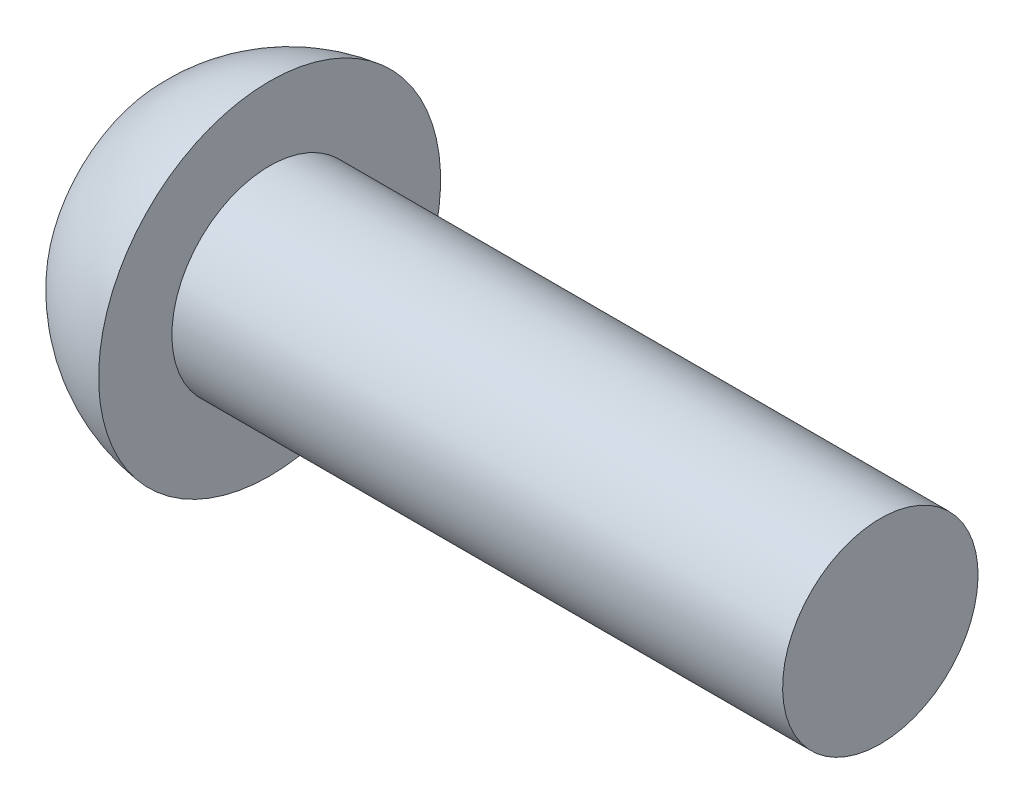
ISO-10303-21;
HEADER;
FILE_DESCRIPTION(('STEP AP214'),'2;1');
FILE_NAME('part.step','',(''),(''),'','','');
FILE_SCHEMA(('AUTOMOTIVE_DESIGN { 1 0 10303 214 1 1 1 1 }'));
ENDSEC;
DATA;
#1=APPLICATION_CONTEXT('core data for automotive mechanical design processes');
#2=APPLICATION_PROTOCOL_DEFINITION('international standard','automotive_design',2000,#1);
#3=PRODUCT_CONTEXT('',#1,'mechanical');
#4=PRODUCT('Part','Part','',(#3));
#5=PRODUCT_RELATED_PRODUCT_CATEGORY('part','',(#4));
#6=PRODUCT_DEFINITION_FORMATION('','',#4);
#7=PRODUCT_DEFINITION_CONTEXT('part definition',#1,'design');
#8=PRODUCT_DEFINITION('design','',#6,#7);
#9=PRODUCT_DEFINITION_SHAPE('','',#8);
#10=(LENGTH_UNIT() NAMED_UNIT(*) SI_UNIT(.MILLI.,.METRE.));
#11=(NAMED_UNIT(*) PLANE_ANGLE_UNIT() SI_UNIT($,.RADIAN.));
#12=(NAMED_UNIT(*) SI_UNIT($,.STERADIAN.) SOLID_ANGLE_UNIT());
#13=UNCERTAINTY_MEASURE_WITH_UNIT(LENGTH_MEASURE(1.E-05),#10,'distance_accuracy_value','');
#14=(GEOMETRIC_REPRESENTATION_CONTEXT(3) GLOBAL_UNCERTAINTY_ASSIGNED_CONTEXT((#13)) GLOBAL_UNIT_ASSIGNED_CONTEXT((#10,
#11,#12)) REPRESENTATION_CONTEXT('',''));
#15=CARTESIAN_POINT('',(0.,0.,0.));
#16=DIRECTION('',(0.,0.,1.));
#17=DIRECTION('',(1.,0.,0.));
#18=AXIS2_PLACEMENT_3D('',#15,#16,#17);
#19=CARTESIAN_POINT('',(-4.4,4.75,0.));
#20=DIRECTION('',(1.,0.,0.));
#21=DIRECTION('',(0.,1.,0.));
#22=AXIS2_PLACEMENT_3D('',#19,#20,#21);
#23=PLANE('',#22);
#24=DIRECTION('',(0.,1.,0.));
#25=VECTOR('',#24,1.);
#26=CARTESIAN_POINT('',(-4.4,-1.44337567297407,2.5));
#27=LINE('',#26,#25);
#28=CARTESIAN_POINT('',(-4.4,-1.44337567297407,2.5));
#29=VERTEX_POINT('',#28);
#30=CARTESIAN_POINT('',(-4.4,1.44337567297406,2.5));
#31=VERTEX_POINT('',#30);
#32=EDGE_CURVE('E128',#29,#31,#27,.T.);
#33=ORIENTED_EDGE('',*,*,#32,.F.);
#34=DIRECTION('',(0.,0.5,0.866025403784439));
#35=VECTOR('',#34,1.);
#36=CARTESIAN_POINT('',(-4.4,-2.88675134594813,0.));
#37=LINE('',#36,#35);
#38=CARTESIAN_POINT('',(-4.4,-2.88675134594813,0.));
#39=VERTEX_POINT('',#38);
#40=EDGE_CURVE('E37',#39,#29,#37,.T.);
#41=ORIENTED_EDGE('',*,*,#40,.F.);
#42=DIRECTION('',(0.,-0.5,0.866025403784439));
#43=VECTOR('',#42,1.);
#44=CARTESIAN_POINT('',(-4.4,-1.44337567297407,-2.5));
#45=LINE('',#44,#43);
#46=CARTESIAN_POINT('',(-4.4,-1.44337567297407,-2.5));
#47=VERTEX_POINT('',#46);
#48=EDGE_CURVE('E98',#47,#39,#45,.T.);
#49=ORIENTED_EDGE('',*,*,#48,.F.);
#50=DIRECTION('',(0.,-1.,0.));
#51=VECTOR('',#50,1.);
#52=CARTESIAN_POINT('',(-4.4,1.44337567297406,-2.5));
#53=LINE('',#52,#51);
#54=CARTESIAN_POINT('',(-4.4,1.44337567297406,-2.5));
#55=VERTEX_POINT('',#54);
#56=EDGE_CURVE('E136',#55,#47,#53,.T.);
#57=ORIENTED_EDGE('',*,*,#56,.F.);
#58=DIRECTION('',(0.,-0.5,-0.866025403784439));
#59=VECTOR('',#58,1.);
#60=CARTESIAN_POINT('',(-4.4,2.88675134594813,0.));
#61=LINE('',#60,#59);
#62=CARTESIAN_POINT('',(-4.4,2.88675134594813,0.));
#63=VERTEX_POINT('',#62);
#64=EDGE_CURVE('E133',#63,#55,#61,.T.);
#65=ORIENTED_EDGE('',*,*,#64,.F.);
#66=DIRECTION('',(0.,0.5,-0.866025403784439));
#67=VECTOR('',#66,1.);
#68=CARTESIAN_POINT('',(-4.4,1.44337567297406,2.5));
#69=LINE('',#68,#67);
#70=EDGE_CURVE('E130',#31,#63,#69,.T.);
#71=ORIENTED_EDGE('',*,*,#70,.F.);
#72=EDGE_LOOP('',(#33,#41,#49,#57,#65,#71));
#73=FACE_BOUND('',#72,.T.);
#74=CARTESIAN_POINT('',(-4.4,0.,0.));
#75=DIRECTION('',(-1.,0.,0.));
#76=DIRECTION('',(0.,-1.,0.));
#77=AXIS2_PLACEMENT_3D('',#74,#75,#76);
#78=CIRCLE('',#77,4.75);
#79=CARTESIAN_POINT('',(-4.4,4.75,0.));
#80=VERTEX_POINT('',#79);
#81=EDGE_CURVE('E10',#80,#80,#78,.T.);
#82=ORIENTED_EDGE('',*,*,#81,.T.);
#83=EDGE_LOOP('',(#82));
#84=FACE_BOUND('',#83,.T.);
#85=ADVANCED_FACE('F15',(#73,#84),#23,.F.);
#86=CARTESIAN_POINT('',(0.804261363636363,0.,0.));
#87=DIRECTION('',(-1.,0.,0.));
#88=DIRECTION('',(0.,1.,0.));
#89=AXIS2_PLACEMENT_3D('',#86,#87,#88);
#90=SPHERICAL_SURFACE('',#89,7.04605111683404);
#91=CARTESIAN_POINT('',(0.,0.,0.));
#92=DIRECTION('',(-1.,0.,0.));
#93=DIRECTION('',(0.,-1.,0.));
#94=AXIS2_PLACEMENT_3D('',#91,#92,#93);
#95=CIRCLE('',#94,7.);
#96=CARTESIAN_POINT('',(0.,7.,0.));
#97=VERTEX_POINT('',#96);
#98=EDGE_CURVE('E22',#97,#97,#95,.T.);
#99=CARTESIAN_POINT('',(-4.4,4.75,0.));
#100=CARTESIAN_POINT('',(-4.36454288512353,4.78884817687277,0.));
#101=CARTESIAN_POINT('',(-4.32865063666699,4.82729919585031,0.));
#102=CARTESIAN_POINT('',(-4.25601420845185,4.90338795759343,0.));
#103=CARTESIAN_POINT('',(-4.21927002869325,4.94102570035901,0.));
#104=CARTESIAN_POINT('',(-4.14494807373204,5.01546894925673,0.));
#105=CARTESIAN_POINT('',(-4.10737029852943,5.05227445538887,0.));
#106=CARTESIAN_POINT('',(-4.03140002103513,5.12503479721963,0.));
#107=CARTESIAN_POINT('',(-3.99300751874343,5.16098963291825,0.));
#108=CARTESIAN_POINT('',(-3.91542703331494,5.23203059738727,0.));
#109=CARTESIAN_POINT('',(-3.87623905017815,5.26711672615766,0.));
#110=CARTESIAN_POINT('',(-3.79708725643281,5.33640268375269,0.));
#111=CARTESIAN_POINT('',(-3.75712344582426,5.37060251257732,0.));
#112=CARTESIAN_POINT('',(-3.67644003736148,5.43809871961472,0.));
#113=CARTESIAN_POINT('',(-3.63572043950726,5.47139509782748,0.));
#114=CARTESIAN_POINT('',(-3.55354587637469,5.53706770659259,0.));
#115=CARTESIAN_POINT('',(-3.51209091109635,5.56944393714494,0.));
#116=CARTESIAN_POINT('',(-3.42846640154439,5.63326001481711,0.));
#117=CARTESIAN_POINT('',(-3.38629685727077,5.66469986193692,0.));
#118=CARTESIAN_POINT('',(-3.30126433654013,5.72662740658146,0.));
#119=CARTESIAN_POINT('',(-3.25840136008311,5.75711510410618,0.));
#120=CARTESIAN_POINT('',(-3.17200346952228,5.81712306086254,0.));
#121=CARTESIAN_POINT('',(-3.12846855541847,5.84664332009417,0.));
#122=CARTESIAN_POINT('',(-3.04074862106097,5.90470159671148,0.));
#123=CARTESIAN_POINT('',(-2.99656360080728,5.93323961409716,0.));
#124=CARTESIAN_POINT('',(-2.90756561165547,5.98931909603472,0.));
#125=CARTESIAN_POINT('',(-2.86275264275736,6.01686056058659,0.));
#126=CARTESIAN_POINT('',(-2.7725212287204,6.07093312561122,0.));
#127=CARTESIAN_POINT('',(-2.72710278358156,6.09746422608398,0.));
#128=CARTESIAN_POINT('',(-2.63568319309557,6.14950275837327,0.));
#129=CARTESIAN_POINT('',(-2.58968204774841,6.17501019018981,0.));
#130=CARTESIAN_POINT('',(-2.49712012508546,6.22498859392971,0.));
#131=CARTESIAN_POINT('',(-2.45055934776966,6.24945956585307,0.));
#132=CARTESIAN_POINT('',(-2.35690151004828,6.29735277832423,0.));
#133=CARTESIAN_POINT('',(-2.3098044496427,6.32077501887203,0.));
#134=CARTESIAN_POINT('',(-2.21509766355104,6.36655902301801,0.));
#135=CARTESIAN_POINT('',(-2.16748793786496,6.3889207866162,0.));
#136=CARTESIAN_POINT('',(-2.07177969610832,6.43257262308734,0.));
#137=CARTESIAN_POINT('',(-2.02368118003776,6.4538626959603,0.));
#138=CARTESIAN_POINT('',(-1.92701947752242,6.49536047462719,0.));
#139=CARTESIAN_POINT('',(-1.87845629107762,6.51556818042112,0.));
#140=CARTESIAN_POINT('',(-1.78088960084274,6.55489109135176,0.));
#141=CARTESIAN_POINT('',(-1.73188609705264,6.57400629648847,0.));
#142=CARTESIAN_POINT('',(-1.6334633459625,6.61113462038416,0.));
#143=CARTESIAN_POINT('',(-1.58404409866244,6.62914773914314,0.));
#144=CARTESIAN_POINT('',(-1.48481464287089,6.66406285722607,0.));
#145=CARTESIAN_POINT('',(-1.43500443437938,6.68096485655003,0.));
#146=CARTESIAN_POINT('',(-1.33501803457968,6.71364925990396,0.));
#147=CARTESIAN_POINT('',(-1.28484184327149,6.72943166393393,0.));
#148=CARTESIAN_POINT('',(-1.18414863974081,6.75986896226994,0.));
#149=CARTESIAN_POINT('',(-1.13363162751832,6.77452385657597,0.));
#150=CARTESIAN_POINT('',(-1.03228211498123,6.80269878650557,0.));
#151=CARTESIAN_POINT('',(-0.981449614666624,6.81621882212914,0.));
#152=CARTESIAN_POINT('',(-0.879494616945795,6.84211725461744,0.));
#153=CARTESIAN_POINT('',(-0.82837211953957,6.85449565148218,0.));
#154=CARTESIAN_POINT('',(-0.725862764172364,6.87810459968334,0.));
#155=CARTESIAN_POINT('',(-0.674475906211383,6.88933515101977,0.));
#156=CARTESIAN_POINT('',(-0.571463598425517,6.91064277398991,0.));
#157=CARTESIAN_POINT('',(-0.519838148600632,6.92071984562363,0.));
#158=CARTESIAN_POINT('',(-0.416374546974104,6.93971546470693,0.));
#159=CARTESIAN_POINT('',(-0.364536395172462,6.94863401215652,0.));
#160=CARTESIAN_POINT('',(-0.260673380361007,6.96530807734709,0.));
#161=CARTESIAN_POINT('',(-0.208648517351195,6.97306359508808,0.));
#162=CARTESIAN_POINT('',(-0.104438186102562,6.98740783534348,0.));
#163=CARTESIAN_POINT('',(-0.0522527178637416,6.99399655785788,0.));
#164=CARTESIAN_POINT('',(0.,7.,0.));
#165=B_SPLINE_CURVE_WITH_KNOTS('',3,(#99,#100,#101,#102,#103,#104,#105,#106,#107,#108,#109,#110,
#111,#112,#113,#114,#115,#116,#117,#118,#119,#120,#121,#122,#123,#124,#125,#126,#127,#128,#129,
#130,#131,#132,#133,#134,#135,#136,#137,#138,#139,#140,#141,#142,#143,#144,#145,#146,#147,#148,
#149,#150,#151,#152,#153,#154,#155,#156,#157,#158,#159,#160,#161,#162,#163,#164),.UNSPECIFIED.,
.F.,.F.,(4,2,2,2,2,2,2,2,2,2,2,2,2,2,2,2,2,2,2,2,2,2,2,2,2,2,2,2,2,2,2,2,4),(0.,
0.157786082792231,0.315572165584463,0.473358248376695,0.631144331168927,0.788930413961158,
0.946716496753389,1.10450257954562,1.26228866233785,1.42007474513008,1.57786082792231,
1.73564691071455,1.89343299350678,2.05121907629901,2.20900515909124,2.36679124188347,
2.52457732467571,2.68236340746794,2.84014949026017,2.9979355730524,3.15572165584463,
3.31350773863686,3.47129382142909,3.62907990422133,3.78686598701356,3.94465206980579,
4.10243815259802,4.26022423539025,4.41801031818248,4.57579640097472,4.73358248376695,
4.89136856655918,5.04915464935141),.UNSPECIFIED.);
#166=EDGE_CURVE('BSEAM161',#80,#97,#165,.T.);
#167=ORIENTED_EDGE('',*,*,#81,.F.);
#168=ORIENTED_EDGE('',*,*,#98,.T.);
#169=ORIENTED_EDGE('',*,*,#166,.T.);
#170=ORIENTED_EDGE('',*,*,#166,.F.);
#171=EDGE_LOOP('',(#167,#169,#168,#170));
#172=FACE_BOUND('',#171,.T.);
#173=ADVANCED_FACE('F161',(#172),#90,.T.);
#174=CARTESIAN_POINT('',(0.,4.,0.));
#175=DIRECTION('',(-1.,0.,0.));
#176=DIRECTION('',(0.,-1.,0.));
#177=AXIS2_PLACEMENT_3D('',#174,#175,#176);
#178=PLANE('',#177);
#179=ORIENTED_EDGE('',*,*,#98,.F.);
#180=EDGE_LOOP('',(#179));
#181=FACE_BOUND('',#180,.T.);
#182=CARTESIAN_POINT('',(0.,0.,0.));
#183=DIRECTION('',(-1.,0.,0.));
#184=DIRECTION('',(0.,-1.,0.));
#185=AXIS2_PLACEMENT_3D('',#182,#183,#184);
#186=CIRCLE('',#185,4.);
#187=CARTESIAN_POINT('',(0.,-4.,0.));
#188=VERTEX_POINT('',#187);
#189=EDGE_CURVE('E156',#188,#188,#186,.T.);
#190=ORIENTED_EDGE('',*,*,#189,.T.);
#191=EDGE_LOOP('',(#190));
#192=FACE_BOUND('',#191,.T.);
#193=ADVANCED_FACE('F163',(#181,#192),#178,.F.);
#194=CARTESIAN_POINT('',(-4.4,0.,0.));
#195=DIRECTION('',(-1.,0.,0.));
#196=DIRECTION('',(0.,-1.,0.));
#197=AXIS2_PLACEMENT_3D('',#194,#195,#196);
#198=CYLINDRICAL_SURFACE('',#197,4.);
#199=ORIENTED_EDGE('',*,*,#189,.F.);
#200=EDGE_LOOP('',(#199));
#201=FACE_BOUND('',#200,.T.);
#202=CARTESIAN_POINT('',(25.,0.,0.));
#203=DIRECTION('',(-1.,0.,0.));
#204=DIRECTION('',(0.,-1.,0.));
#205=AXIS2_PLACEMENT_3D('',#202,#203,#204);
#206=CIRCLE('',#205,4.);
#207=CARTESIAN_POINT('',(25.,-4.,0.));
#208=VERTEX_POINT('',#207);
#209=EDGE_CURVE('E153',#208,#208,#206,.T.);
#210=ORIENTED_EDGE('',*,*,#209,.T.);
#211=EDGE_LOOP('',(#210));
#212=FACE_BOUND('',#211,.T.);
#213=ADVANCED_FACE('F166',(#201,#212),#198,.T.);
#214=CARTESIAN_POINT('',(25.,4.,0.));
#215=DIRECTION('',(-1.,0.,0.));
#216=DIRECTION('',(0.,-1.,0.));
#217=AXIS2_PLACEMENT_3D('',#214,#215,#216);
#218=PLANE('',#217);
#219=ORIENTED_EDGE('',*,*,#209,.F.);
#220=EDGE_LOOP('',(#219));
#221=FACE_BOUND('',#220,.T.);
#222=ADVANCED_FACE('F172',(#221),#218,.F.);
#223=CARTESIAN_POINT('',(-1.8,0.,0.));
#224=DIRECTION('',(-1.,0.,0.));
#225=DIRECTION('',(0.,0.,1.));
#226=AXIS2_PLACEMENT_3D('',#223,#224,#225);
#227=PLANE('',#226);
#228=CARTESIAN_POINT('',(-1.8,0.,0.));
#229=DIRECTION('',(1.,0.,0.));
#230=DIRECTION('',(0.,1.,0.));
#231=AXIS2_PLACEMENT_3D('',#228,#229,#230);
#232=CIRCLE('',#231,2.5);
#233=CARTESIAN_POINT('',(-1.8,2.1650635094611,1.25));
#234=VERTEX_POINT('',#233);
#235=CARTESIAN_POINT('',(-1.8,0.,2.5));
#236=VERTEX_POINT('',#235);
#237=EDGE_CURVE('E151',#234,#236,#232,.T.);
#238=ORIENTED_EDGE('',*,*,#237,.T.);
#239=DIRECTION('',(0.,1.,0.));
#240=VECTOR('',#239,1.);
#241=CARTESIAN_POINT('',(-1.8,-1.44337567297407,2.5));
#242=LINE('',#241,#240);
#243=CARTESIAN_POINT('',(-1.8,1.44337567297406,2.5));
#244=VERTEX_POINT('',#243);
#245=EDGE_CURVE('E111',#236,#244,#242,.T.);
#246=ORIENTED_EDGE('',*,*,#245,.T.);
#247=DIRECTION('',(0.,0.5,-0.866025403784439));
#248=VECTOR('',#247,1.);
#249=CARTESIAN_POINT('',(-1.8,1.44337567297406,2.5));
#250=LINE('',#249,#248);
#251=EDGE_CURVE('E114',#244,#234,#250,.T.);
#252=ORIENTED_EDGE('',*,*,#251,.T.);
#253=EDGE_LOOP('',(#238,#246,#252));
#254=FACE_BOUND('',#253,.T.);
#255=ADVANCED_FACE('F177',(#254),#227,.T.);
#256=CARTESIAN_POINT('',(-1.8,-2.1650635094611,1.25));
#257=VERTEX_POINT('',#256);
#258=EDGE_CURVE('E94',#236,#257,#232,.T.);
#259=ORIENTED_EDGE('',*,*,#258,.T.);
#260=DIRECTION('',(0.,0.5,0.866025403784439));
#261=VECTOR('',#260,1.);
#262=CARTESIAN_POINT('',(-1.8,-2.88675134594813,0.));
#263=LINE('',#262,#261);
#264=CARTESIAN_POINT('',(-1.8,-1.44337567297407,2.5));
#265=VERTEX_POINT('',#264);
#266=EDGE_CURVE('E89',#257,#265,#263,.T.);
#267=ORIENTED_EDGE('',*,*,#266,.T.);
#268=EDGE_CURVE('E92',#265,#236,#242,.T.);
#269=ORIENTED_EDGE('',*,*,#268,.T.);
#270=EDGE_LOOP('',(#259,#267,#269));
#271=FACE_BOUND('',#270,.T.);
#272=ADVANCED_FACE('F90',(#271),#227,.T.);
#273=CARTESIAN_POINT('',(-1.8,-2.1650635094611,-1.25));
#274=VERTEX_POINT('',#273);
#275=EDGE_CURVE('E211',#257,#274,#232,.T.);
#276=ORIENTED_EDGE('',*,*,#275,.T.);
#277=DIRECTION('',(0.,-0.5,0.866025403784439));
#278=VECTOR('',#277,1.);
#279=CARTESIAN_POINT('',(-1.8,-1.44337567297407,-2.5));
#280=LINE('',#279,#278);
#281=CARTESIAN_POINT('',(-1.8,-2.88675134594813,0.));
#282=VERTEX_POINT('',#281);
#283=EDGE_CURVE('E124',#274,#282,#280,.T.);
#284=ORIENTED_EDGE('',*,*,#283,.T.);
#285=EDGE_CURVE('E97',#282,#257,#263,.T.);
#286=ORIENTED_EDGE('',*,*,#285,.T.);
#287=EDGE_LOOP('',(#276,#284,#286));
#288=FACE_BOUND('',#287,.T.);
#289=ADVANCED_FACE('F233',(#288),#227,.T.);
#290=CARTESIAN_POINT('',(-1.8,0.,-2.5));
#291=VERTEX_POINT('',#290);
#292=EDGE_CURVE('E212',#274,#291,#232,.T.);
#293=ORIENTED_EDGE('',*,*,#292,.T.);
#294=DIRECTION('',(0.,-1.,0.));
#295=VECTOR('',#294,1.);
#296=CARTESIAN_POINT('',(-1.8,1.44337567297406,-2.5));
#297=LINE('',#296,#295);
#298=CARTESIAN_POINT('',(-1.8,-1.44337567297407,-2.5));
#299=VERTEX_POINT('',#298);
#300=EDGE_CURVE('E120',#291,#299,#297,.T.);
#301=ORIENTED_EDGE('',*,*,#300,.T.);
#302=EDGE_CURVE('E106',#299,#274,#280,.T.);
#303=ORIENTED_EDGE('',*,*,#302,.T.);
#304=EDGE_LOOP('',(#293,#301,#303));
#305=FACE_BOUND('',#304,.T.);
#306=ADVANCED_FACE('F229',(#305),#227,.T.);
#307=CARTESIAN_POINT('',(-1.8,2.1650635094611,-1.25));
#308=VERTEX_POINT('',#307);
#309=EDGE_CURVE('E215',#291,#308,#232,.T.);
#310=ORIENTED_EDGE('',*,*,#309,.T.);
#311=DIRECTION('',(0.,-0.5,-0.866025403784439));
#312=VECTOR('',#311,1.);
#313=CARTESIAN_POINT('',(-1.8,2.88675134594813,0.));
#314=LINE('',#313,#312);
#315=CARTESIAN_POINT('',(-1.8,1.44337567297406,-2.5));
#316=VERTEX_POINT('',#315);
#317=EDGE_CURVE('E118',#308,#316,#314,.T.);
#318=ORIENTED_EDGE('',*,*,#317,.T.);
#319=EDGE_CURVE('E121',#316,#291,#297,.T.);
#320=ORIENTED_EDGE('',*,*,#319,.T.);
#321=EDGE_LOOP('',(#310,#318,#320));
#322=FACE_BOUND('',#321,.T.);
#323=ADVANCED_FACE('F224',(#322),#227,.T.);
#324=EDGE_CURVE('E143',#308,#234,#232,.T.);
#325=ORIENTED_EDGE('',*,*,#324,.T.);
#326=CARTESIAN_POINT('',(-1.8,2.88675134594813,0.));
#327=VERTEX_POINT('',#326);
#328=EDGE_CURVE('E112',#234,#327,#250,.T.);
#329=ORIENTED_EDGE('',*,*,#328,.T.);
#330=EDGE_CURVE('E29',#327,#308,#314,.T.);
#331=ORIENTED_EDGE('',*,*,#330,.T.);
#332=EDGE_LOOP('',(#325,#329,#331));
#333=FACE_BOUND('',#332,.T.);
#334=ADVANCED_FACE('F185',(#333),#227,.T.);
#335=CARTESIAN_POINT('',(-1.8,-2.88675134594813,0.));
#336=DIRECTION('',(0.,-0.866025403784439,0.5));
#337=DIRECTION('',(0.,-0.5,-0.866025403784439));
#338=AXIS2_PLACEMENT_3D('',#335,#336,#337);
#339=PLANE('',#338);
#340=ORIENTED_EDGE('',*,*,#40,.T.);
#341=DIRECTION('',(-1.,0.,0.));
#342=VECTOR('',#341,1.);
#343=CARTESIAN_POINT('',(-1.8,-1.44337567297407,2.5));
#344=LINE('',#343,#342);
#345=EDGE_CURVE('E100',#265,#29,#344,.T.);
#346=ORIENTED_EDGE('',*,*,#345,.F.);
#347=ORIENTED_EDGE('',*,*,#266,.F.);
#348=ORIENTED_EDGE('',*,*,#285,.F.);
#349=DIRECTION('',(-1.,0.,0.));
#350=VECTOR('',#349,1.);
#351=CARTESIAN_POINT('',(-1.8,-2.88675134594813,0.));
#352=LINE('',#351,#350);
#353=EDGE_CURVE('E141',#282,#39,#352,.T.);
#354=ORIENTED_EDGE('',*,*,#353,.T.);
#355=EDGE_LOOP('',(#340,#346,#347,#348,#354));
#356=FACE_BOUND('',#355,.T.);
#357=ADVANCED_FACE('F101',(#356),#339,.F.);
#358=CARTESIAN_POINT('',(-1.8,-1.44337567297407,-2.5));
#359=DIRECTION('',(0.,-0.866025403784439,-0.5));
#360=DIRECTION('',(0.,0.5,-0.866025403784439));
#361=AXIS2_PLACEMENT_3D('',#358,#359,#360);
#362=PLANE('',#361);
#363=ORIENTED_EDGE('',*,*,#48,.T.);
#364=ORIENTED_EDGE('',*,*,#353,.F.);
#365=ORIENTED_EDGE('',*,*,#283,.F.);
#366=ORIENTED_EDGE('',*,*,#302,.F.);
#367=DIRECTION('',(-1.,0.,0.));
#368=VECTOR('',#367,1.);
#369=CARTESIAN_POINT('',(-1.8,-1.44337567297407,-2.5));
#370=LINE('',#369,#368);
#371=EDGE_CURVE('E144',#299,#47,#370,.T.);
#372=ORIENTED_EDGE('',*,*,#371,.T.);
#373=EDGE_LOOP('',(#363,#364,#365,#366,#372));
#374=FACE_BOUND('',#373,.T.);
#375=ADVANCED_FACE('F231',(#374),#362,.F.);
#376=CARTESIAN_POINT('',(-1.8,1.44337567297406,-2.5));
#377=DIRECTION('',(0.,0.,-1.));
#378=DIRECTION('',(-1.,0.,0.));
#379=AXIS2_PLACEMENT_3D('',#376,#377,#378);
#380=PLANE('',#379);
#381=ORIENTED_EDGE('',*,*,#56,.T.);
#382=ORIENTED_EDGE('',*,*,#371,.F.);
#383=ORIENTED_EDGE('',*,*,#300,.F.);
#384=ORIENTED_EDGE('',*,*,#319,.F.);
#385=DIRECTION('',(-1.,0.,0.));
#386=VECTOR('',#385,1.);
#387=CARTESIAN_POINT('',(-1.8,1.44337567297406,-2.5));
#388=LINE('',#387,#386);
#389=EDGE_CURVE('E146',#316,#55,#388,.T.);
#390=ORIENTED_EDGE('',*,*,#389,.T.);
#391=EDGE_LOOP('',(#381,#382,#383,#384,#390));
#392=FACE_BOUND('',#391,.T.);
#393=ADVANCED_FACE('F226',(#392),#380,.F.);
#394=CARTESIAN_POINT('',(-1.8,2.88675134594813,0.));
#395=DIRECTION('',(0.,0.866025403784439,-0.5));
#396=DIRECTION('',(0.,0.5,0.866025403784439));
#397=AXIS2_PLACEMENT_3D('',#394,#395,#396);
#398=PLANE('',#397);
#399=ORIENTED_EDGE('',*,*,#64,.T.);
#400=ORIENTED_EDGE('',*,*,#389,.F.);
#401=ORIENTED_EDGE('',*,*,#317,.F.);
#402=ORIENTED_EDGE('',*,*,#330,.F.);
#403=DIRECTION('',(-1.,0.,0.));
#404=VECTOR('',#403,1.);
#405=CARTESIAN_POINT('',(-1.8,2.88675134594813,0.));
#406=LINE('',#405,#404);
#407=EDGE_CURVE('E148',#327,#63,#406,.T.);
#408=ORIENTED_EDGE('',*,*,#407,.T.);
#409=EDGE_LOOP('',(#399,#400,#401,#402,#408));
#410=FACE_BOUND('',#409,.T.);
#411=ADVANCED_FACE('F221',(#410),#398,.F.);
#412=CARTESIAN_POINT('',(-1.8,1.44337567297406,2.5));
#413=DIRECTION('',(0.,0.866025403784439,0.5));
#414=DIRECTION('',(0.,-0.5,0.866025403784439));
#415=AXIS2_PLACEMENT_3D('',#412,#413,#414);
#416=PLANE('',#415);
#417=ORIENTED_EDGE('',*,*,#70,.T.);
#418=ORIENTED_EDGE('',*,*,#407,.F.);
#419=ORIENTED_EDGE('',*,*,#328,.F.);
#420=ORIENTED_EDGE('',*,*,#251,.F.);
#421=DIRECTION('',(-1.,0.,0.));
#422=VECTOR('',#421,1.);
#423=CARTESIAN_POINT('',(-1.8,1.44337567297406,2.5));
#424=LINE('',#423,#422);
#425=EDGE_CURVE('E105',#244,#31,#424,.T.);
#426=ORIENTED_EDGE('',*,*,#425,.T.);
#427=EDGE_LOOP('',(#417,#418,#419,#420,#426));
#428=FACE_BOUND('',#427,.T.);
#429=ADVANCED_FACE('F201',(#428),#416,.F.);
#430=CARTESIAN_POINT('',(-1.8,-1.44337567297407,2.5));
#431=DIRECTION('',(0.,0.,1.));
#432=DIRECTION('',(0.,-1.,0.));
#433=AXIS2_PLACEMENT_3D('',#430,#431,#432);
#434=PLANE('',#433);
#435=ORIENTED_EDGE('',*,*,#32,.T.);
#436=ORIENTED_EDGE('',*,*,#425,.F.);
#437=ORIENTED_EDGE('',*,*,#245,.F.);
#438=ORIENTED_EDGE('',*,*,#268,.F.);
#439=ORIENTED_EDGE('',*,*,#345,.T.);
#440=EDGE_LOOP('',(#435,#436,#437,#438,#439));
#441=FACE_BOUND('',#440,.T.);
#442=ADVANCED_FACE('F109',(#441),#434,.F.);
#443=CARTESIAN_POINT('',(-0.297848452431083,0.,0.));
#444=DIRECTION('',(-1.,0.,0.));
#445=DIRECTION('',(0.,-1.,0.));
#446=AXIS2_PLACEMENT_3D('',#443,#444,#445);
#447=CONICAL_SURFACE('',#446,0.,1.02974425867665);
#448=ORIENTED_EDGE('',*,*,#237,.F.);
#449=ORIENTED_EDGE('',*,*,#324,.F.);
#450=ORIENTED_EDGE('',*,*,#309,.F.);
#451=ORIENTED_EDGE('',*,*,#292,.F.);
#452=ORIENTED_EDGE('',*,*,#275,.F.);
#453=ORIENTED_EDGE('',*,*,#258,.F.);
#454=EDGE_LOOP('',(#448,#449,#450,#451,#452,#453));
#455=FACE_BOUND('',#454,.T.);
#456=CARTESIAN_POINT('',(-0.297848452431083,0.,0.));
#457=VERTEX_POINT('',#456);
#458=VERTEX_LOOP('',#457);
#459=FACE_BOUND('',#458,.T.);
#460=ADVANCED_FACE('F206',(#455,#459),#447,.F.);
#461=CLOSED_SHELL('',(#85,#173,#193,#213,#222,#255,#272,#289,#306,#323,#334,#357,#375,#393,#411,
#429,#442,#460));
#462=MANIFOLD_SOLID_BREP('B1',#461);
#463=ADVANCED_BREP_SHAPE_REPRESENTATION('',(#18,#462),#14);
#464=SHAPE_DEFINITION_REPRESENTATION(#9,#463);
ENDSEC;
END-ISO-10303-21;
